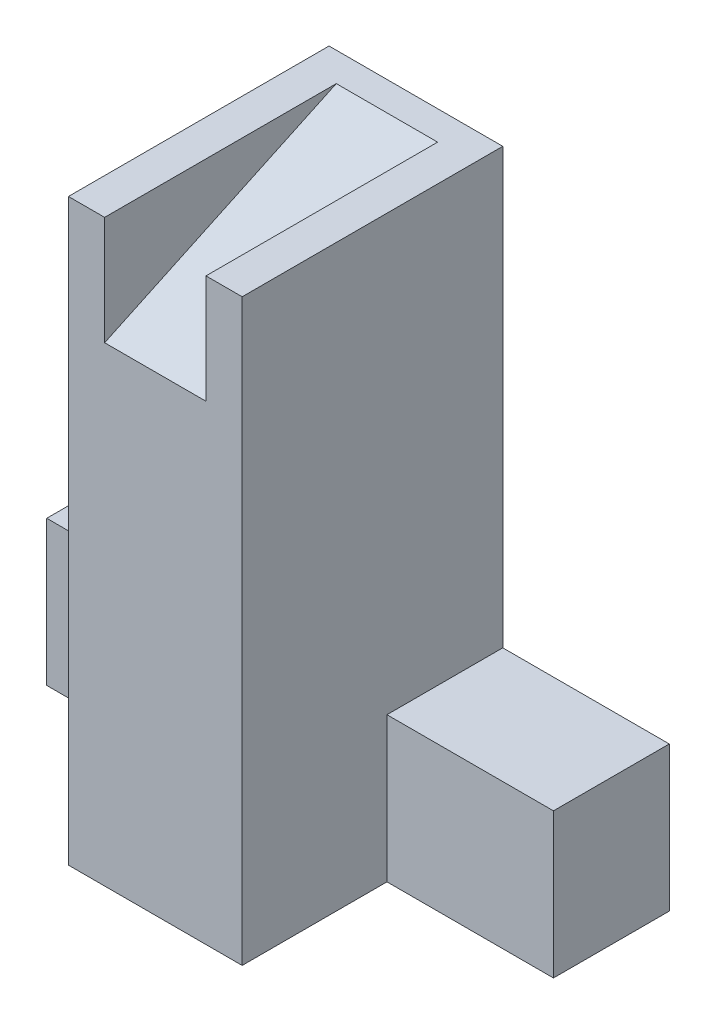
ISO-10303-21;
HEADER;
FILE_DESCRIPTION(('STEP AP214'),'2;1');
FILE_NAME('part.step','',(''),(''),'','','');
FILE_SCHEMA(('AUTOMOTIVE_DESIGN { 1 0 10303 214 1 1 1 1 }'));
ENDSEC;
DATA;
#1=APPLICATION_CONTEXT('core data for automotive mechanical design processes');
#2=APPLICATION_PROTOCOL_DEFINITION('international standard','automotive_design',2000,#1);
#3=PRODUCT_CONTEXT('',#1,'mechanical');
#4=PRODUCT('Part','Part','',(#3));
#5=PRODUCT_RELATED_PRODUCT_CATEGORY('part','',(#4));
#6=PRODUCT_DEFINITION_FORMATION('','',#4);
#7=PRODUCT_DEFINITION_CONTEXT('part definition',#1,'design');
#8=PRODUCT_DEFINITION('design','',#6,#7);
#9=PRODUCT_DEFINITION_SHAPE('','',#8);
#10=(LENGTH_UNIT() NAMED_UNIT(*) SI_UNIT(.MILLI.,.METRE.));
#11=(NAMED_UNIT(*) PLANE_ANGLE_UNIT() SI_UNIT($,.RADIAN.));
#12=(NAMED_UNIT(*) SI_UNIT($,.STERADIAN.) SOLID_ANGLE_UNIT());
#13=UNCERTAINTY_MEASURE_WITH_UNIT(LENGTH_MEASURE(1.E-05),#10,'distance_accuracy_value','');
#14=(GEOMETRIC_REPRESENTATION_CONTEXT(3) GLOBAL_UNCERTAINTY_ASSIGNED_CONTEXT((#13)) GLOBAL_UNIT_ASSIGNED_CONTEXT((#10,
#11,#12)) REPRESENTATION_CONTEXT('',''));
#15=CARTESIAN_POINT('',(0.,0.,0.));
#16=DIRECTION('',(0.,0.,1.));
#17=DIRECTION('',(1.,0.,0.));
#18=AXIS2_PLACEMENT_3D('',#15,#16,#17);
#19=CARTESIAN_POINT('',(0.,0.,36000.));
#20=DIRECTION('',(1.,0.,0.));
#21=DIRECTION('',(0.,1.,0.));
#22=AXIS2_PLACEMENT_3D('',#19,#20,#21);
#23=PLANE('',#22);
#24=DIRECTION('',(0.,0.,-1.));
#25=VECTOR('',#24,1.);
#26=CARTESIAN_POINT('',(0.,20000.,16000.));
#27=LINE('',#26,#25);
#28=CARTESIAN_POINT('',(0.,20000.,16000.));
#29=VERTEX_POINT('',#28);
#30=CARTESIAN_POINT('',(0.,20000.,0.));
#31=VERTEX_POINT('',#30);
#32=EDGE_CURVE('E153',#29,#31,#27,.T.);
#33=ORIENTED_EDGE('',*,*,#32,.F.);
#34=DIRECTION('',(0.,-1.,0.));
#35=VECTOR('',#34,1.);
#36=CARTESIAN_POINT('',(0.,0.,16000.));
#37=LINE('',#36,#35);
#38=CARTESIAN_POINT('',(0.,0.,16000.));
#39=VERTEX_POINT('',#38);
#40=EDGE_CURVE('E144',#29,#39,#37,.T.);
#41=ORIENTED_EDGE('',*,*,#40,.T.);
#42=DIRECTION('',(0.,0.,-1.));
#43=VECTOR('',#42,1.);
#44=CARTESIAN_POINT('',(0.,0.,36000.));
#45=LINE('',#44,#43);
#46=CARTESIAN_POINT('',(0.,0.,36000.));
#47=VERTEX_POINT('',#46);
#48=EDGE_CURVE('E11',#47,#39,#45,.T.);
#49=ORIENTED_EDGE('',*,*,#48,.F.);
#50=DIRECTION('',(0.,-1.,0.));
#51=VECTOR('',#50,1.);
#52=CARTESIAN_POINT('',(0.,0.,36000.));
#53=LINE('',#52,#51);
#54=CARTESIAN_POINT('',(-1.4210854715202E-11,80000.,36000.));
#55=VERTEX_POINT('',#54);
#56=EDGE_CURVE('E202',#55,#47,#53,.T.);
#57=ORIENTED_EDGE('',*,*,#56,.F.);
#58=DIRECTION('',(0.,0.,-1.));
#59=VECTOR('',#58,1.);
#60=CARTESIAN_POINT('',(-1.4210854715202E-11,80000.,36000.));
#61=LINE('',#60,#59);
#62=CARTESIAN_POINT('',(-1.4210854715202E-11,80000.,0.));
#63=VERTEX_POINT('',#62);
#64=EDGE_CURVE('E214',#55,#63,#61,.T.);
#65=ORIENTED_EDGE('',*,*,#64,.T.);
#66=DIRECTION('',(0.,-1.,0.));
#67=VECTOR('',#66,1.);
#68=CARTESIAN_POINT('',(0.,0.,0.));
#69=LINE('',#68,#67);
#70=EDGE_CURVE('E199',#63,#31,#69,.T.);
#71=ORIENTED_EDGE('',*,*,#70,.T.);
#72=EDGE_LOOP('',(#33,#41,#49,#57,#65,#71));
#73=FACE_BOUND('',#72,.T.);
#74=ADVANCED_FACE('F33',(#73),#23,.F.);
#75=CARTESIAN_POINT('',(0.,0.,36000.));
#76=DIRECTION('',(0.,1.,0.));
#77=DIRECTION('',(0.,0.,1.));
#78=AXIS2_PLACEMENT_3D('',#75,#76,#77);
#79=PLANE('',#78);
#80=DIRECTION('',(1.,0.,0.));
#81=VECTOR('',#80,1.);
#82=CARTESIAN_POINT('',(0.,0.,0.));
#83=LINE('',#82,#81);
#84=CARTESIAN_POINT('',(-23000.,0.,0.));
#85=VERTEX_POINT('',#84);
#86=CARTESIAN_POINT('',(47000.,-2.81668763803891E-12,0.));
#87=VERTEX_POINT('',#86);
#88=EDGE_CURVE('E217',#85,#87,#83,.T.);
#89=ORIENTED_EDGE('',*,*,#88,.T.);
#90=DIRECTION('',(0.,0.,-1.));
#91=VECTOR('',#90,1.);
#92=CARTESIAN_POINT('',(47000.,-2.81668763803891E-12,16000.));
#93=LINE('',#92,#91);
#94=CARTESIAN_POINT('',(47000.,-2.81668763803891E-12,16000.));
#95=VERTEX_POINT('',#94);
#96=EDGE_CURVE('E173',#95,#87,#93,.T.);
#97=ORIENTED_EDGE('',*,*,#96,.F.);
#98=DIRECTION('',(-1.,0.,0.));
#99=VECTOR('',#98,1.);
#100=CARTESIAN_POINT('',(24000.,0.,16000.));
#101=LINE('',#100,#99);
#102=CARTESIAN_POINT('',(24000.,0.,16000.));
#103=VERTEX_POINT('',#102);
#104=EDGE_CURVE('E166',#95,#103,#101,.T.);
#105=ORIENTED_EDGE('',*,*,#104,.T.);
#106=DIRECTION('',(0.,0.,-1.));
#107=VECTOR('',#106,1.);
#108=CARTESIAN_POINT('',(24000.,0.,36000.));
#109=LINE('',#108,#107);
#110=CARTESIAN_POINT('',(24000.,0.,36000.));
#111=VERTEX_POINT('',#110);
#112=EDGE_CURVE('E40',#111,#103,#109,.T.);
#113=ORIENTED_EDGE('',*,*,#112,.F.);
#114=DIRECTION('',(1.,0.,0.));
#115=VECTOR('',#114,1.);
#116=CARTESIAN_POINT('',(0.,0.,36000.));
#117=LINE('',#116,#115);
#118=EDGE_CURVE('E205',#47,#111,#117,.T.);
#119=ORIENTED_EDGE('',*,*,#118,.F.);
#120=ORIENTED_EDGE('',*,*,#48,.T.);
#121=DIRECTION('',(-1.,0.,0.));
#122=VECTOR('',#121,1.);
#123=CARTESIAN_POINT('',(0.,0.,16000.));
#124=LINE('',#123,#122);
#125=CARTESIAN_POINT('',(-23000.,0.,16000.));
#126=VERTEX_POINT('',#125);
#127=EDGE_CURVE('E47',#39,#126,#124,.T.);
#128=ORIENTED_EDGE('',*,*,#127,.T.);
#129=DIRECTION('',(0.,0.,-1.));
#130=VECTOR('',#129,1.);
#131=CARTESIAN_POINT('',(-23000.,0.,16000.));
#132=LINE('',#131,#130);
#133=EDGE_CURVE('E129',#126,#85,#132,.T.);
#134=ORIENTED_EDGE('',*,*,#133,.T.);
#135=EDGE_LOOP('',(#89,#97,#105,#113,#119,#120,#128,#134));
#136=FACE_BOUND('',#135,.T.);
#137=ADVANCED_FACE('F142',(#136),#79,.F.);
#138=CARTESIAN_POINT('',(24000.,0.,36000.));
#139=DIRECTION('',(-1.,0.,0.));
#140=DIRECTION('',(0.,-1.,0.));
#141=AXIS2_PLACEMENT_3D('',#138,#139,#140);
#142=PLANE('',#141);
#143=ORIENTED_EDGE('',*,*,#112,.T.);
#144=DIRECTION('',(0.,1.,0.));
#145=VECTOR('',#144,1.);
#146=CARTESIAN_POINT('',(24000.,0.,16000.));
#147=LINE('',#146,#145);
#148=CARTESIAN_POINT('',(24000.,20000.,16000.));
#149=VERTEX_POINT('',#148);
#150=EDGE_CURVE('E156',#103,#149,#147,.T.);
#151=ORIENTED_EDGE('',*,*,#150,.T.);
#152=DIRECTION('',(0.,0.,-1.));
#153=VECTOR('',#152,1.);
#154=CARTESIAN_POINT('',(24000.,20000.,16000.));
#155=LINE('',#154,#153);
#156=CARTESIAN_POINT('',(24000.,20000.,0.));
#157=VERTEX_POINT('',#156);
#158=EDGE_CURVE('E169',#149,#157,#155,.T.);
#159=ORIENTED_EDGE('',*,*,#158,.T.);
#160=DIRECTION('',(0.,1.,0.));
#161=VECTOR('',#160,1.);
#162=CARTESIAN_POINT('',(24000.,0.,0.));
#163=LINE('',#162,#161);
#164=CARTESIAN_POINT('',(24000.,80000.,0.));
#165=VERTEX_POINT('',#164);
#166=EDGE_CURVE('E219',#157,#165,#163,.T.);
#167=ORIENTED_EDGE('',*,*,#166,.T.);
#168=DIRECTION('',(0.,0.,-1.));
#169=VECTOR('',#168,1.);
#170=CARTESIAN_POINT('',(24000.,80000.,36000.));
#171=LINE('',#170,#169);
#172=CARTESIAN_POINT('',(24000.,80000.,36000.));
#173=VERTEX_POINT('',#172);
#174=EDGE_CURVE('E224',#173,#165,#171,.T.);
#175=ORIENTED_EDGE('',*,*,#174,.F.);
#176=DIRECTION('',(0.,1.,0.));
#177=VECTOR('',#176,1.);
#178=CARTESIAN_POINT('',(24000.,0.,36000.));
#179=LINE('',#178,#177);
#180=EDGE_CURVE('E208',#111,#173,#179,.T.);
#181=ORIENTED_EDGE('',*,*,#180,.F.);
#182=EDGE_LOOP('',(#143,#151,#159,#167,#175,#181));
#183=FACE_BOUND('',#182,.T.);
#184=ADVANCED_FACE('F230',(#183),#142,.F.);
#185=CARTESIAN_POINT('',(-1.4210854715202E-11,80000.,36000.));
#186=DIRECTION('',(0.,-1.,0.));
#187=DIRECTION('',(0.,0.,-1.));
#188=AXIS2_PLACEMENT_3D('',#185,#186,#187);
#189=PLANE('',#188);
#190=DIRECTION('',(-1.,0.,0.));
#191=VECTOR('',#190,1.);
#192=CARTESIAN_POINT('',(-1.4210854715202E-11,80000.,36000.));
#193=LINE('',#192,#191);
#194=CARTESIAN_POINT('',(4999.99999999999,80000.,36000.));
#195=VERTEX_POINT('',#194);
#196=EDGE_CURVE('E210',#195,#55,#193,.T.);
#197=ORIENTED_EDGE('',*,*,#196,.F.);
#198=DIRECTION('',(0.,0.,1.));
#199=VECTOR('',#198,1.);
#200=CARTESIAN_POINT('',(4999.99999999999,80000.,36000.));
#201=LINE('',#200,#199);
#202=CARTESIAN_POINT('',(4999.99999999999,80000.,4000.));
#203=VERTEX_POINT('',#202);
#204=EDGE_CURVE('E187',#203,#195,#201,.T.);
#205=ORIENTED_EDGE('',*,*,#204,.F.);
#206=DIRECTION('',(1.,0.,0.));
#207=VECTOR('',#206,1.);
#208=CARTESIAN_POINT('',(4999.99999999999,80000.,4000.));
#209=LINE('',#208,#207);
#210=CARTESIAN_POINT('',(19000.,80000.,4000.));
#211=VERTEX_POINT('',#210);
#212=EDGE_CURVE('E196',#203,#211,#209,.T.);
#213=ORIENTED_EDGE('',*,*,#212,.T.);
#214=DIRECTION('',(0.,0.,1.));
#215=VECTOR('',#214,1.);
#216=CARTESIAN_POINT('',(19000.,80000.,36000.));
#217=LINE('',#216,#215);
#218=CARTESIAN_POINT('',(19000.,80000.,36000.));
#219=VERTEX_POINT('',#218);
#220=EDGE_CURVE('E184',#211,#219,#217,.T.);
#221=ORIENTED_EDGE('',*,*,#220,.T.);
#222=EDGE_CURVE('E211',#173,#219,#193,.T.);
#223=ORIENTED_EDGE('',*,*,#222,.F.);
#224=ORIENTED_EDGE('',*,*,#174,.T.);
#225=DIRECTION('',(-1.,0.,0.));
#226=VECTOR('',#225,1.);
#227=CARTESIAN_POINT('',(-1.4210854715202E-11,80000.,0.));
#228=LINE('',#227,#226);
#229=EDGE_CURVE('E206',#165,#63,#228,.T.);
#230=ORIENTED_EDGE('',*,*,#229,.T.);
#231=ORIENTED_EDGE('',*,*,#64,.F.);
#232=EDGE_LOOP('',(#197,#205,#213,#221,#223,#224,#230,#231));
#233=FACE_BOUND('',#232,.T.);
#234=ADVANCED_FACE('F247',(#233),#189,.F.);
#235=CARTESIAN_POINT('',(0.,0.,36000.));
#236=DIRECTION('',(0.,0.,-1.));
#237=DIRECTION('',(-1.,0.,0.));
#238=AXIS2_PLACEMENT_3D('',#235,#236,#237);
#239=PLANE('',#238);
#240=DIRECTION('',(1.,0.,0.));
#241=VECTOR('',#240,1.);
#242=CARTESIAN_POINT('',(4999.99999999999,65000.,36000.));
#243=LINE('',#242,#241);
#244=CARTESIAN_POINT('',(4999.99999999999,65000.,36000.));
#245=VERTEX_POINT('',#244);
#246=CARTESIAN_POINT('',(19000.,65000.,36000.));
#247=VERTEX_POINT('',#246);
#248=EDGE_CURVE('E189',#245,#247,#243,.T.);
#249=ORIENTED_EDGE('',*,*,#248,.F.);
#250=DIRECTION('',(0.,-1.,0.));
#251=VECTOR('',#250,1.);
#252=CARTESIAN_POINT('',(4999.99999999999,65000.,36000.));
#253=LINE('',#252,#251);
#254=EDGE_CURVE('E180',#195,#245,#253,.T.);
#255=ORIENTED_EDGE('',*,*,#254,.F.);
#256=ORIENTED_EDGE('',*,*,#196,.T.);
#257=ORIENTED_EDGE('',*,*,#56,.T.);
#258=ORIENTED_EDGE('',*,*,#118,.T.);
#259=ORIENTED_EDGE('',*,*,#180,.T.);
#260=ORIENTED_EDGE('',*,*,#222,.T.);
#261=DIRECTION('',(0.,-1.,0.));
#262=VECTOR('',#261,1.);
#263=CARTESIAN_POINT('',(19000.,65000.,36000.));
#264=LINE('',#263,#262);
#265=EDGE_CURVE('E176',#219,#247,#264,.T.);
#266=ORIENTED_EDGE('',*,*,#265,.T.);
#267=EDGE_LOOP('',(#249,#255,#256,#257,#258,#259,#260,#266));
#268=FACE_BOUND('',#267,.T.);
#269=ADVANCED_FACE('F254',(#268),#239,.F.);
#270=CARTESIAN_POINT('',(0.,0.,0.));
#271=DIRECTION('',(0.,0.,-1.));
#272=DIRECTION('',(-1.,0.,0.));
#273=AXIS2_PLACEMENT_3D('',#270,#271,#272);
#274=PLANE('',#273);
#275=ORIENTED_EDGE('',*,*,#70,.F.);
#276=ORIENTED_EDGE('',*,*,#229,.F.);
#277=ORIENTED_EDGE('',*,*,#166,.F.);
#278=DIRECTION('',(1.,0.,0.));
#279=VECTOR('',#278,1.);
#280=CARTESIAN_POINT('',(24000.,20000.,0.));
#281=LINE('',#280,#279);
#282=CARTESIAN_POINT('',(47000.,20000.,0.));
#283=VERTEX_POINT('',#282);
#284=EDGE_CURVE('E55',#157,#283,#281,.T.);
#285=ORIENTED_EDGE('',*,*,#284,.T.);
#286=DIRECTION('',(0.,-1.,0.));
#287=VECTOR('',#286,1.);
#288=CARTESIAN_POINT('',(47000.,-2.81668763803891E-12,0.));
#289=LINE('',#288,#287);
#290=EDGE_CURVE('E160',#283,#87,#289,.T.);
#291=ORIENTED_EDGE('',*,*,#290,.T.);
#292=ORIENTED_EDGE('',*,*,#88,.F.);
#293=DIRECTION('',(0.,1.,0.));
#294=VECTOR('',#293,1.);
#295=CARTESIAN_POINT('',(-23000.,0.,0.));
#296=LINE('',#295,#294);
#297=CARTESIAN_POINT('',(-23000.,20000.,0.));
#298=VERTEX_POINT('',#297);
#299=EDGE_CURVE('E134',#85,#298,#296,.T.);
#300=ORIENTED_EDGE('',*,*,#299,.T.);
#301=DIRECTION('',(1.,0.,0.));
#302=VECTOR('',#301,1.);
#303=CARTESIAN_POINT('',(0.,20000.,0.));
#304=LINE('',#303,#302);
#305=EDGE_CURVE('E146',#298,#31,#304,.T.);
#306=ORIENTED_EDGE('',*,*,#305,.T.);
#307=EDGE_LOOP('',(#275,#276,#277,#285,#291,#292,#300,#306));
#308=FACE_BOUND('',#307,.T.);
#309=ADVANCED_FACE('F243',(#308),#274,.T.);
#310=CARTESIAN_POINT('',(4999.99999999999,80000.,4000.));
#311=DIRECTION('',(0.,-0.905458935958868,-0.424433876230719));
#312=DIRECTION('',(0.,0.42443387623072,-0.905458935958869));
#313=AXIS2_PLACEMENT_3D('',#310,#311,#312);
#314=PLANE('',#313);
#315=DIRECTION('',(0.,0.42443387623072,-0.905458935958868));
#316=VECTOR('',#315,1.);
#317=CARTESIAN_POINT('',(19000.,80000.,4000.));
#318=LINE('',#317,#316);
#319=EDGE_CURVE('E192',#247,#211,#318,.T.);
#320=ORIENTED_EDGE('',*,*,#319,.T.);
#321=ORIENTED_EDGE('',*,*,#212,.F.);
#322=DIRECTION('',(0.,0.42443387623072,-0.905458935958868));
#323=VECTOR('',#322,1.);
#324=CARTESIAN_POINT('',(4999.99999999999,80000.,4000.));
#325=LINE('',#324,#323);
#326=EDGE_CURVE('E183',#245,#203,#325,.T.);
#327=ORIENTED_EDGE('',*,*,#326,.F.);
#328=ORIENTED_EDGE('',*,*,#248,.T.);
#329=EDGE_LOOP('',(#320,#321,#327,#328));
#330=FACE_BOUND('',#329,.T.);
#331=ADVANCED_FACE('F260',(#330),#314,.F.);
#332=CARTESIAN_POINT('',(5000.,2.30926389122033E-12,0.));
#333=DIRECTION('',(-1.,0.,0.));
#334=DIRECTION('',(0.,-1.,0.));
#335=AXIS2_PLACEMENT_3D('',#332,#333,#334);
#336=PLANE('',#335);
#337=ORIENTED_EDGE('',*,*,#254,.T.);
#338=ORIENTED_EDGE('',*,*,#326,.T.);
#339=ORIENTED_EDGE('',*,*,#204,.T.);
#340=EDGE_LOOP('',(#337,#338,#339));
#341=FACE_BOUND('',#340,.T.);
#342=ADVANCED_FACE('F258',(#341),#336,.F.);
#343=CARTESIAN_POINT('',(19000.,4.79616346638068E-12,0.));
#344=DIRECTION('',(-1.,0.,0.));
#345=DIRECTION('',(0.,-1.,0.));
#346=AXIS2_PLACEMENT_3D('',#343,#344,#345);
#347=PLANE('',#346);
#348=ORIENTED_EDGE('',*,*,#265,.F.);
#349=ORIENTED_EDGE('',*,*,#220,.F.);
#350=ORIENTED_EDGE('',*,*,#319,.F.);
#351=EDGE_LOOP('',(#348,#349,#350));
#352=FACE_BOUND('',#351,.T.);
#353=ADVANCED_FACE('F263',(#352),#347,.T.);
#354=CARTESIAN_POINT('',(47000.,-2.81668763803891E-12,16000.));
#355=DIRECTION('',(1.,0.,0.));
#356=DIRECTION('',(0.,0.,-1.));
#357=AXIS2_PLACEMENT_3D('',#354,#355,#356);
#358=PLANE('',#357);
#359=ORIENTED_EDGE('',*,*,#290,.F.);
#360=DIRECTION('',(0.,0.,-1.));
#361=VECTOR('',#360,1.);
#362=CARTESIAN_POINT('',(47000.,20000.,16000.));
#363=LINE('',#362,#361);
#364=CARTESIAN_POINT('',(47000.,20000.,16000.));
#365=VERTEX_POINT('',#364);
#366=EDGE_CURVE('E177',#365,#283,#363,.T.);
#367=ORIENTED_EDGE('',*,*,#366,.F.);
#368=DIRECTION('',(0.,-1.,0.));
#369=VECTOR('',#368,1.);
#370=CARTESIAN_POINT('',(47000.,-2.81668763803891E-12,16000.));
#371=LINE('',#370,#369);
#372=EDGE_CURVE('E163',#365,#95,#371,.T.);
#373=ORIENTED_EDGE('',*,*,#372,.T.);
#374=ORIENTED_EDGE('',*,*,#96,.T.);
#375=EDGE_LOOP('',(#359,#367,#373,#374));
#376=FACE_BOUND('',#375,.T.);
#377=ADVANCED_FACE('F265',(#376),#358,.T.);
#378=CARTESIAN_POINT('',(24000.,20000.,16000.));
#379=DIRECTION('',(0.,1.,0.));
#380=DIRECTION('',(-1.,0.,0.));
#381=AXIS2_PLACEMENT_3D('',#378,#379,#380);
#382=PLANE('',#381);
#383=ORIENTED_EDGE('',*,*,#284,.F.);
#384=ORIENTED_EDGE('',*,*,#158,.F.);
#385=DIRECTION('',(1.,0.,0.));
#386=VECTOR('',#385,1.);
#387=CARTESIAN_POINT('',(24000.,20000.,16000.));
#388=LINE('',#387,#386);
#389=EDGE_CURVE('E159',#149,#365,#388,.T.);
#390=ORIENTED_EDGE('',*,*,#389,.T.);
#391=ORIENTED_EDGE('',*,*,#366,.T.);
#392=EDGE_LOOP('',(#383,#384,#390,#391));
#393=FACE_BOUND('',#392,.T.);
#394=ADVANCED_FACE('F237',(#393),#382,.T.);
#395=CARTESIAN_POINT('',(0.,0.,16000.));
#396=DIRECTION('',(0.,0.,-1.));
#397=DIRECTION('',(-1.,0.,0.));
#398=AXIS2_PLACEMENT_3D('',#395,#396,#397);
#399=PLANE('',#398);
#400=ORIENTED_EDGE('',*,*,#150,.F.);
#401=ORIENTED_EDGE('',*,*,#104,.F.);
#402=ORIENTED_EDGE('',*,*,#372,.F.);
#403=ORIENTED_EDGE('',*,*,#389,.F.);
#404=EDGE_LOOP('',(#400,#401,#402,#403));
#405=FACE_BOUND('',#404,.T.);
#406=ADVANCED_FACE('F235',(#405),#399,.F.);
#407=CARTESIAN_POINT('',(0.,20000.,16000.));
#408=DIRECTION('',(0.,1.,0.));
#409=DIRECTION('',(0.,0.,1.));
#410=AXIS2_PLACEMENT_3D('',#407,#408,#409);
#411=PLANE('',#410);
#412=ORIENTED_EDGE('',*,*,#305,.F.);
#413=DIRECTION('',(0.,0.,-1.));
#414=VECTOR('',#413,1.);
#415=CARTESIAN_POINT('',(-23000.,20000.,16000.));
#416=LINE('',#415,#414);
#417=CARTESIAN_POINT('',(-23000.,20000.,16000.));
#418=VERTEX_POINT('',#417);
#419=EDGE_CURVE('E136',#418,#298,#416,.T.);
#420=ORIENTED_EDGE('',*,*,#419,.F.);
#421=DIRECTION('',(1.,0.,0.));
#422=VECTOR('',#421,1.);
#423=CARTESIAN_POINT('',(0.,20000.,16000.));
#424=LINE('',#423,#422);
#425=EDGE_CURVE('E137',#418,#29,#424,.T.);
#426=ORIENTED_EDGE('',*,*,#425,.T.);
#427=ORIENTED_EDGE('',*,*,#32,.T.);
#428=EDGE_LOOP('',(#412,#420,#426,#427));
#429=FACE_BOUND('',#428,.T.);
#430=ADVANCED_FACE('F348',(#429),#411,.T.);
#431=CARTESIAN_POINT('',(-23000.,0.,16000.));
#432=DIRECTION('',(-1.,0.,0.));
#433=DIRECTION('',(0.,0.,1.));
#434=AXIS2_PLACEMENT_3D('',#431,#432,#433);
#435=PLANE('',#434);
#436=ORIENTED_EDGE('',*,*,#299,.F.);
#437=ORIENTED_EDGE('',*,*,#133,.F.);
#438=DIRECTION('',(0.,1.,0.));
#439=VECTOR('',#438,1.);
#440=CARTESIAN_POINT('',(-23000.,0.,16000.));
#441=LINE('',#440,#439);
#442=EDGE_CURVE('E131',#126,#418,#441,.T.);
#443=ORIENTED_EDGE('',*,*,#442,.T.);
#444=ORIENTED_EDGE('',*,*,#419,.T.);
#445=EDGE_LOOP('',(#436,#437,#443,#444));
#446=FACE_BOUND('',#445,.T.);
#447=ADVANCED_FACE('F130',(#446),#435,.T.);
#448=CARTESIAN_POINT('',(0.,0.,16000.));
#449=DIRECTION('',(0.,0.,1.));
#450=DIRECTION('',(1.,0.,0.));
#451=AXIS2_PLACEMENT_3D('',#448,#449,#450);
#452=PLANE('',#451);
#453=ORIENTED_EDGE('',*,*,#40,.F.);
#454=ORIENTED_EDGE('',*,*,#425,.F.);
#455=ORIENTED_EDGE('',*,*,#442,.F.);
#456=ORIENTED_EDGE('',*,*,#127,.F.);
#457=EDGE_LOOP('',(#453,#454,#455,#456));
#458=FACE_BOUND('',#457,.T.);
#459=ADVANCED_FACE('F139',(#458),#452,.T.);
#460=CLOSED_SHELL('',(#74,#137,#184,#234,#269,#309,#331,#342,#353,#377,#394,#406,#430,#447,#459));
#461=MANIFOLD_SOLID_BREP('B2',#460);
#462=ADVANCED_BREP_SHAPE_REPRESENTATION('',(#18,#461),#14);
#463=SHAPE_DEFINITION_REPRESENTATION(#9,#462);
ENDSEC;
END-ISO-10303-21;
